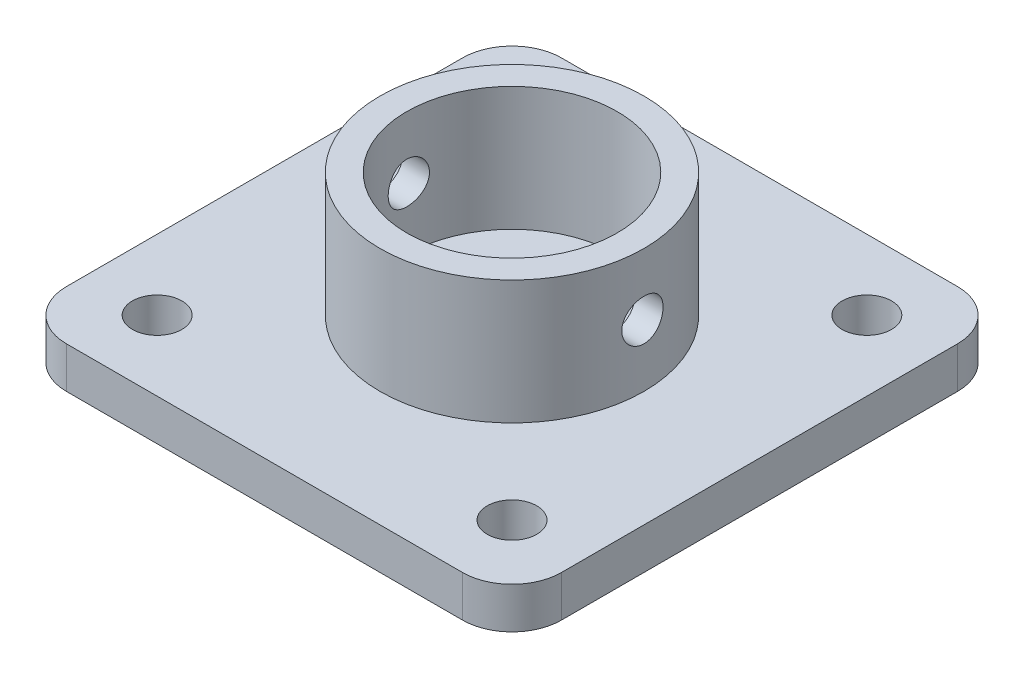
ISO-10303-21;
HEADER;
FILE_DESCRIPTION(('STEP AP214'),'2;1');
FILE_NAME('part.step','',(''),(''),'','','');
FILE_SCHEMA(('AUTOMOTIVE_DESIGN { 1 0 10303 214 1 1 1 1 }'));
ENDSEC;
DATA;
#1=APPLICATION_CONTEXT('core data for automotive mechanical design processes');
#2=APPLICATION_PROTOCOL_DEFINITION('international standard','automotive_design',2000,#1);
#3=PRODUCT_CONTEXT('',#1,'mechanical');
#4=PRODUCT('Part','Part','',(#3));
#5=PRODUCT_RELATED_PRODUCT_CATEGORY('part','',(#4));
#6=PRODUCT_DEFINITION_FORMATION('','',#4);
#7=PRODUCT_DEFINITION_CONTEXT('part definition',#1,'design');
#8=PRODUCT_DEFINITION('design','',#6,#7);
#9=PRODUCT_DEFINITION_SHAPE('','',#8);
#10=(LENGTH_UNIT() NAMED_UNIT(*) SI_UNIT(.MILLI.,.METRE.));
#11=(NAMED_UNIT(*) PLANE_ANGLE_UNIT() SI_UNIT($,.RADIAN.));
#12=(NAMED_UNIT(*) SI_UNIT($,.STERADIAN.) SOLID_ANGLE_UNIT());
#13=UNCERTAINTY_MEASURE_WITH_UNIT(LENGTH_MEASURE(1.E-05),#10,'distance_accuracy_value','');
#14=(GEOMETRIC_REPRESENTATION_CONTEXT(3) GLOBAL_UNCERTAINTY_ASSIGNED_CONTEXT((#13)) GLOBAL_UNIT_ASSIGNED_CONTEXT((#10,
#11,#12)) REPRESENTATION_CONTEXT('',''));
#15=CARTESIAN_POINT('',(0.,0.,0.));
#16=DIRECTION('',(0.,0.,1.));
#17=DIRECTION('',(1.,0.,0.));
#18=AXIS2_PLACEMENT_3D('',#15,#16,#17);
#19=CARTESIAN_POINT('',(0.,5.,0.));
#20=DIRECTION('',(0.,-1.,0.));
#21=DIRECTION('',(0.,0.,-1.));
#22=AXIS2_PLACEMENT_3D('',#19,#20,#21);
#23=PLANE('',#22);
#24=CARTESIAN_POINT('',(0.,5.,0.));
#25=DIRECTION('',(0.,-1.,0.));
#26=DIRECTION('',(0.,0.,-1.));
#27=AXIS2_PLACEMENT_3D('',#24,#25,#26);
#28=CIRCLE('',#27,16.);
#29=CARTESIAN_POINT('',(0.,5.,-16.));
#30=VERTEX_POINT('',#29);
#31=EDGE_CURVE('E11',#30,#30,#28,.F.);
#32=ORIENTED_EDGE('',*,*,#31,.F.);
#33=EDGE_LOOP('',(#32));
#34=FACE_BOUND('',#33,.T.);
#35=DIRECTION('',(0.,0.,1.));
#36=VECTOR('',#35,1.);
#37=CARTESIAN_POINT('',(-30.,5.,30.));
#38=LINE('',#37,#36);
#39=CARTESIAN_POINT('',(-30.,5.,-24.));
#40=VERTEX_POINT('',#39);
#41=CARTESIAN_POINT('',(-30.,5.,24.));
#42=VERTEX_POINT('',#41);
#43=EDGE_CURVE('E270',#40,#42,#38,.T.);
#44=ORIENTED_EDGE('',*,*,#43,.T.);
#45=CARTESIAN_POINT('',(-24.,5.,24.));
#46=DIRECTION('',(0.,-1.,0.));
#47=DIRECTION('',(0.,0.,-1.));
#48=AXIS2_PLACEMENT_3D('',#45,#46,#47);
#49=CIRCLE('',#48,6.);
#50=CARTESIAN_POINT('',(-24.,5.,30.));
#51=VERTEX_POINT('',#50);
#52=EDGE_CURVE('E168',#42,#51,#49,.F.);
#53=ORIENTED_EDGE('',*,*,#52,.T.);
#54=DIRECTION('',(1.,0.,0.));
#55=VECTOR('',#54,1.);
#56=CARTESIAN_POINT('',(-30.,5.,30.));
#57=LINE('',#56,#55);
#58=CARTESIAN_POINT('',(24.,5.,30.));
#59=VERTEX_POINT('',#58);
#60=EDGE_CURVE('E139',#51,#59,#57,.T.);
#61=ORIENTED_EDGE('',*,*,#60,.T.);
#62=CARTESIAN_POINT('',(24.,5.,24.));
#63=DIRECTION('',(0.,-1.,0.));
#64=DIRECTION('',(0.,0.,-1.));
#65=AXIS2_PLACEMENT_3D('',#62,#63,#64);
#66=CIRCLE('',#65,6.);
#67=CARTESIAN_POINT('',(30.,5.,24.));
#68=VERTEX_POINT('',#67);
#69=EDGE_CURVE('E163',#59,#68,#66,.F.);
#70=ORIENTED_EDGE('',*,*,#69,.T.);
#71=DIRECTION('',(0.,0.,-1.));
#72=VECTOR('',#71,1.);
#73=CARTESIAN_POINT('',(30.,5.,30.));
#74=LINE('',#73,#72);
#75=CARTESIAN_POINT('',(30.,5.,-24.));
#76=VERTEX_POINT('',#75);
#77=EDGE_CURVE('E146',#68,#76,#74,.T.);
#78=ORIENTED_EDGE('',*,*,#77,.T.);
#79=CARTESIAN_POINT('',(24.,5.,-24.));
#80=DIRECTION('',(0.,-1.,0.));
#81=DIRECTION('',(0.,0.,-1.));
#82=AXIS2_PLACEMENT_3D('',#79,#80,#81);
#83=CIRCLE('',#82,6.);
#84=CARTESIAN_POINT('',(24.,5.,-30.));
#85=VERTEX_POINT('',#84);
#86=EDGE_CURVE('E74',#76,#85,#83,.F.);
#87=ORIENTED_EDGE('',*,*,#86,.T.);
#88=DIRECTION('',(-1.,0.,0.));
#89=VECTOR('',#88,1.);
#90=CARTESIAN_POINT('',(-30.,5.,-30.));
#91=LINE('',#90,#89);
#92=CARTESIAN_POINT('',(-24.,5.,-30.));
#93=VERTEX_POINT('',#92);
#94=EDGE_CURVE('E149',#85,#93,#91,.T.);
#95=ORIENTED_EDGE('',*,*,#94,.T.);
#96=CARTESIAN_POINT('',(-24.,5.,-24.));
#97=DIRECTION('',(0.,-1.,0.));
#98=DIRECTION('',(0.,0.,-1.));
#99=AXIS2_PLACEMENT_3D('',#96,#97,#98);
#100=CIRCLE('',#99,6.);
#101=EDGE_CURVE('E166',#93,#40,#100,.F.);
#102=ORIENTED_EDGE('',*,*,#101,.T.);
#103=EDGE_LOOP('',(#44,#53,#61,#70,#78,#87,#95,#102));
#104=FACE_BOUND('',#103,.T.);
#105=CARTESIAN_POINT('',(21.5,5.,-21.5));
#106=DIRECTION('',(0.,1.,0.));
#107=DIRECTION('',(0.,0.,1.));
#108=AXIS2_PLACEMENT_3D('',#105,#106,#107);
#109=CIRCLE('',#108,3.);
#110=CARTESIAN_POINT('',(21.5,5.,-18.5));
#111=VERTEX_POINT('',#110);
#112=EDGE_CURVE('E266',#111,#111,#109,.T.);
#113=ORIENTED_EDGE('',*,*,#112,.F.);
#114=EDGE_LOOP('',(#113));
#115=FACE_BOUND('',#114,.T.);
#116=CARTESIAN_POINT('',(-21.5,5.,-21.5));
#117=DIRECTION('',(0.,1.,0.));
#118=DIRECTION('',(0.,0.,1.));
#119=AXIS2_PLACEMENT_3D('',#116,#117,#118);
#120=CIRCLE('',#119,2.99999999999999);
#121=CARTESIAN_POINT('',(-21.5,5.,-18.5));
#122=VERTEX_POINT('',#121);
#123=EDGE_CURVE('E277',#122,#122,#120,.T.);
#124=ORIENTED_EDGE('',*,*,#123,.F.);
#125=EDGE_LOOP('',(#124));
#126=FACE_BOUND('',#125,.T.);
#127=CARTESIAN_POINT('',(-21.5,5.,21.5));
#128=DIRECTION('',(0.,1.,0.));
#129=DIRECTION('',(0.,0.,1.));
#130=AXIS2_PLACEMENT_3D('',#127,#128,#129);
#131=CIRCLE('',#130,3.);
#132=CARTESIAN_POINT('',(-21.5,5.,24.5));
#133=VERTEX_POINT('',#132);
#134=EDGE_CURVE('E283',#133,#133,#131,.T.);
#135=ORIENTED_EDGE('',*,*,#134,.F.);
#136=EDGE_LOOP('',(#135));
#137=FACE_BOUND('',#136,.T.);
#138=CARTESIAN_POINT('',(21.5,5.,21.5));
#139=DIRECTION('',(0.,1.,0.));
#140=DIRECTION('',(0.,0.,1.));
#141=AXIS2_PLACEMENT_3D('',#138,#139,#140);
#142=CIRCLE('',#141,3.);
#143=CARTESIAN_POINT('',(21.5,5.,24.5));
#144=VERTEX_POINT('',#143);
#145=EDGE_CURVE('E289',#144,#144,#142,.T.);
#146=ORIENTED_EDGE('',*,*,#145,.F.);
#147=EDGE_LOOP('',(#146));
#148=FACE_BOUND('',#147,.T.);
#149=ADVANCED_FACE('F45',(#34,#104,#115,#126,#137,#148),#23,.F.);
#150=CARTESIAN_POINT('',(0.,0.,0.));
#151=DIRECTION('',(0.,-1.,0.));
#152=DIRECTION('',(0.,0.,-1.));
#153=AXIS2_PLACEMENT_3D('',#150,#151,#152);
#154=PLANE('',#153);
#155=CARTESIAN_POINT('',(-21.5,0.,21.5));
#156=DIRECTION('',(0.,1.,0.));
#157=DIRECTION('',(0.,0.,1.));
#158=AXIS2_PLACEMENT_3D('',#155,#156,#157);
#159=CIRCLE('',#158,3.);
#160=CARTESIAN_POINT('',(-21.5,0.,24.5));
#161=VERTEX_POINT('',#160);
#162=EDGE_CURVE('E286',#161,#161,#159,.T.);
#163=ORIENTED_EDGE('',*,*,#162,.T.);
#164=EDGE_LOOP('',(#163));
#165=FACE_BOUND('',#164,.T.);
#166=CARTESIAN_POINT('',(21.5,0.,-21.5));
#167=DIRECTION('',(0.,1.,0.));
#168=DIRECTION('',(0.,0.,1.));
#169=AXIS2_PLACEMENT_3D('',#166,#167,#168);
#170=CIRCLE('',#169,3.);
#171=CARTESIAN_POINT('',(21.5,0.,-18.5));
#172=VERTEX_POINT('',#171);
#173=EDGE_CURVE('E274',#172,#172,#170,.T.);
#174=ORIENTED_EDGE('',*,*,#173,.T.);
#175=EDGE_LOOP('',(#174));
#176=FACE_BOUND('',#175,.T.);
#177=DIRECTION('',(1.,0.,0.));
#178=VECTOR('',#177,1.);
#179=CARTESIAN_POINT('',(-30.,0.,30.));
#180=LINE('',#179,#178);
#181=CARTESIAN_POINT('',(-24.,0.,30.));
#182=VERTEX_POINT('',#181);
#183=CARTESIAN_POINT('',(24.,0.,30.));
#184=VERTEX_POINT('',#183);
#185=EDGE_CURVE('E136',#182,#184,#180,.T.);
#186=ORIENTED_EDGE('',*,*,#185,.F.);
#187=CARTESIAN_POINT('',(-24.,0.,24.));
#188=DIRECTION('',(0.,-1.,0.));
#189=DIRECTION('',(0.,0.,-1.));
#190=AXIS2_PLACEMENT_3D('',#187,#188,#189);
#191=CIRCLE('',#190,6.);
#192=CARTESIAN_POINT('',(-30.,0.,24.));
#193=VERTEX_POINT('',#192);
#194=EDGE_CURVE('E119',#182,#193,#191,.T.);
#195=ORIENTED_EDGE('',*,*,#194,.T.);
#196=DIRECTION('',(0.,0.,1.));
#197=VECTOR('',#196,1.);
#198=CARTESIAN_POINT('',(-30.,0.,30.));
#199=LINE('',#198,#197);
#200=CARTESIAN_POINT('',(-30.,0.,-24.));
#201=VERTEX_POINT('',#200);
#202=EDGE_CURVE('E147',#201,#193,#199,.T.);
#203=ORIENTED_EDGE('',*,*,#202,.F.);
#204=CARTESIAN_POINT('',(-24.,0.,-24.));
#205=DIRECTION('',(0.,-1.,0.));
#206=DIRECTION('',(0.,0.,-1.));
#207=AXIS2_PLACEMENT_3D('',#204,#205,#206);
#208=CIRCLE('',#207,6.);
#209=CARTESIAN_POINT('',(-24.,0.,-30.));
#210=VERTEX_POINT('',#209);
#211=EDGE_CURVE('E130',#201,#210,#208,.T.);
#212=ORIENTED_EDGE('',*,*,#211,.T.);
#213=DIRECTION('',(-1.,0.,0.));
#214=VECTOR('',#213,1.);
#215=CARTESIAN_POINT('',(-30.,0.,-30.));
#216=LINE('',#215,#214);
#217=CARTESIAN_POINT('',(24.,0.,-30.));
#218=VERTEX_POINT('',#217);
#219=EDGE_CURVE('E151',#218,#210,#216,.T.);
#220=ORIENTED_EDGE('',*,*,#219,.F.);
#221=CARTESIAN_POINT('',(24.,0.,-24.));
#222=DIRECTION('',(0.,-1.,0.));
#223=DIRECTION('',(0.,0.,-1.));
#224=AXIS2_PLACEMENT_3D('',#221,#222,#223);
#225=CIRCLE('',#224,6.);
#226=CARTESIAN_POINT('',(30.,0.,-24.));
#227=VERTEX_POINT('',#226);
#228=EDGE_CURVE('E157',#218,#227,#225,.T.);
#229=ORIENTED_EDGE('',*,*,#228,.T.);
#230=DIRECTION('',(0.,0.,-1.));
#231=VECTOR('',#230,1.);
#232=CARTESIAN_POINT('',(30.,0.,30.));
#233=LINE('',#232,#231);
#234=CARTESIAN_POINT('',(30.,0.,24.));
#235=VERTEX_POINT('',#234);
#236=EDGE_CURVE('E265',#235,#227,#233,.T.);
#237=ORIENTED_EDGE('',*,*,#236,.F.);
#238=CARTESIAN_POINT('',(24.,0.,24.));
#239=DIRECTION('',(0.,-1.,0.));
#240=DIRECTION('',(0.,0.,-1.));
#241=AXIS2_PLACEMENT_3D('',#238,#239,#240);
#242=CIRCLE('',#241,6.);
#243=EDGE_CURVE('E140',#235,#184,#242,.T.);
#244=ORIENTED_EDGE('',*,*,#243,.T.);
#245=EDGE_LOOP('',(#186,#195,#203,#212,#220,#229,#237,#244));
#246=FACE_BOUND('',#245,.T.);
#247=CARTESIAN_POINT('',(-21.5,0.,-21.5));
#248=DIRECTION('',(0.,1.,0.));
#249=DIRECTION('',(0.,0.,1.));
#250=AXIS2_PLACEMENT_3D('',#247,#248,#249);
#251=CIRCLE('',#250,2.99999999999999);
#252=CARTESIAN_POINT('',(-21.5,0.,-18.5));
#253=VERTEX_POINT('',#252);
#254=EDGE_CURVE('E280',#253,#253,#251,.T.);
#255=ORIENTED_EDGE('',*,*,#254,.T.);
#256=EDGE_LOOP('',(#255));
#257=FACE_BOUND('',#256,.T.);
#258=CARTESIAN_POINT('',(21.5,0.,21.5));
#259=DIRECTION('',(0.,1.,0.));
#260=DIRECTION('',(0.,0.,1.));
#261=AXIS2_PLACEMENT_3D('',#258,#259,#260);
#262=CIRCLE('',#261,3.);
#263=CARTESIAN_POINT('',(21.5,0.,24.5));
#264=VERTEX_POINT('',#263);
#265=EDGE_CURVE('E292',#264,#264,#262,.T.);
#266=ORIENTED_EDGE('',*,*,#265,.T.);
#267=EDGE_LOOP('',(#266));
#268=FACE_BOUND('',#267,.T.);
#269=ADVANCED_FACE('F143',(#165,#176,#246,#257,#268),#154,.T.);
#270=CARTESIAN_POINT('',(30.,5.,30.));
#271=DIRECTION('',(-1.,0.,0.));
#272=DIRECTION('',(0.,0.,1.));
#273=AXIS2_PLACEMENT_3D('',#270,#271,#272);
#274=PLANE('',#273);
#275=ORIENTED_EDGE('',*,*,#236,.T.);
#276=DIRECTION('',(0.,-1.,0.));
#277=VECTOR('',#276,1.);
#278=CARTESIAN_POINT('',(30.,5.,-24.));
#279=LINE('',#278,#277);
#280=EDGE_CURVE('E59',#227,#76,#279,.F.);
#281=ORIENTED_EDGE('',*,*,#280,.T.);
#282=ORIENTED_EDGE('',*,*,#77,.F.);
#283=DIRECTION('',(0.,-1.,0.));
#284=VECTOR('',#283,1.);
#285=CARTESIAN_POINT('',(30.,5.,24.));
#286=LINE('',#285,#284);
#287=EDGE_CURVE('E174',#68,#235,#286,.T.);
#288=ORIENTED_EDGE('',*,*,#287,.T.);
#289=EDGE_LOOP('',(#275,#281,#282,#288));
#290=FACE_BOUND('',#289,.T.);
#291=ADVANCED_FACE('F235',(#290),#274,.F.);
#292=CARTESIAN_POINT('',(-30.,5.,-30.));
#293=DIRECTION('',(0.,0.,1.));
#294=DIRECTION('',(1.,0.,0.));
#295=AXIS2_PLACEMENT_3D('',#292,#293,#294);
#296=PLANE('',#295);
#297=ORIENTED_EDGE('',*,*,#219,.T.);
#298=DIRECTION('',(0.,-1.,0.));
#299=VECTOR('',#298,1.);
#300=CARTESIAN_POINT('',(-24.,5.,-30.));
#301=LINE('',#300,#299);
#302=EDGE_CURVE('E67',#210,#93,#301,.F.);
#303=ORIENTED_EDGE('',*,*,#302,.T.);
#304=ORIENTED_EDGE('',*,*,#94,.F.);
#305=DIRECTION('',(0.,-1.,0.));
#306=VECTOR('',#305,1.);
#307=CARTESIAN_POINT('',(24.,5.,-30.));
#308=LINE('',#307,#306);
#309=EDGE_CURVE('E170',#85,#218,#308,.T.);
#310=ORIENTED_EDGE('',*,*,#309,.T.);
#311=EDGE_LOOP('',(#297,#303,#304,#310));
#312=FACE_BOUND('',#311,.T.);
#313=ADVANCED_FACE('F242',(#312),#296,.F.);
#314=CARTESIAN_POINT('',(-30.,5.,30.));
#315=DIRECTION('',(1.,0.,0.));
#316=DIRECTION('',(0.,0.,-1.));
#317=AXIS2_PLACEMENT_3D('',#314,#315,#316);
#318=PLANE('',#317);
#319=ORIENTED_EDGE('',*,*,#202,.T.);
#320=DIRECTION('',(0.,-1.,0.));
#321=VECTOR('',#320,1.);
#322=CARTESIAN_POINT('',(-30.,5.,24.));
#323=LINE('',#322,#321);
#324=EDGE_CURVE('E124',#193,#42,#323,.F.);
#325=ORIENTED_EDGE('',*,*,#324,.T.);
#326=ORIENTED_EDGE('',*,*,#43,.F.);
#327=DIRECTION('',(0.,-1.,0.));
#328=VECTOR('',#327,1.);
#329=CARTESIAN_POINT('',(-30.,5.,-24.));
#330=LINE('',#329,#328);
#331=EDGE_CURVE('E129',#40,#201,#330,.T.);
#332=ORIENTED_EDGE('',*,*,#331,.T.);
#333=EDGE_LOOP('',(#319,#325,#326,#332));
#334=FACE_BOUND('',#333,.T.);
#335=ADVANCED_FACE('F239',(#334),#318,.F.);
#336=CARTESIAN_POINT('',(-30.,5.,30.));
#337=DIRECTION('',(0.,0.,-1.));
#338=DIRECTION('',(-1.,0.,0.));
#339=AXIS2_PLACEMENT_3D('',#336,#337,#338);
#340=PLANE('',#339);
#341=ORIENTED_EDGE('',*,*,#60,.F.);
#342=DIRECTION('',(0.,-1.,0.));
#343=VECTOR('',#342,1.);
#344=CARTESIAN_POINT('',(-24.,5.,30.));
#345=LINE('',#344,#343);
#346=EDGE_CURVE('E123',#51,#182,#345,.T.);
#347=ORIENTED_EDGE('',*,*,#346,.T.);
#348=ORIENTED_EDGE('',*,*,#185,.T.);
#349=DIRECTION('',(0.,-1.,0.));
#350=VECTOR('',#349,1.);
#351=CARTESIAN_POINT('',(24.,5.,30.));
#352=LINE('',#351,#350);
#353=EDGE_CURVE('E141',#184,#59,#352,.F.);
#354=ORIENTED_EDGE('',*,*,#353,.T.);
#355=EDGE_LOOP('',(#341,#347,#348,#354));
#356=FACE_BOUND('',#355,.T.);
#357=ADVANCED_FACE('F135',(#356),#340,.F.);
#358=CARTESIAN_POINT('',(21.5,5.,-21.5));
#359=DIRECTION('',(0.,-1.,0.));
#360=DIRECTION('',(0.,0.,-1.));
#361=AXIS2_PLACEMENT_3D('',#358,#359,#360);
#362=CYLINDRICAL_SURFACE('',#361,3.);
#363=ORIENTED_EDGE('',*,*,#112,.T.);
#364=EDGE_LOOP('',(#363));
#365=FACE_BOUND('',#364,.T.);
#366=ORIENTED_EDGE('',*,*,#173,.F.);
#367=EDGE_LOOP('',(#366));
#368=FACE_BOUND('',#367,.T.);
#369=ADVANCED_FACE('F224',(#365,#368),#362,.F.);
#370=CARTESIAN_POINT('',(-21.5,5.,-21.5));
#371=DIRECTION('',(0.,-1.,0.));
#372=DIRECTION('',(0.,0.,-1.));
#373=AXIS2_PLACEMENT_3D('',#370,#371,#372);
#374=CYLINDRICAL_SURFACE('',#373,2.99999999999999);
#375=ORIENTED_EDGE('',*,*,#123,.T.);
#376=EDGE_LOOP('',(#375));
#377=FACE_BOUND('',#376,.T.);
#378=ORIENTED_EDGE('',*,*,#254,.F.);
#379=EDGE_LOOP('',(#378));
#380=FACE_BOUND('',#379,.T.);
#381=ADVANCED_FACE('F220',(#377,#380),#374,.F.);
#382=CARTESIAN_POINT('',(-21.5,5.,21.5));
#383=DIRECTION('',(0.,-1.,0.));
#384=DIRECTION('',(0.,0.,-1.));
#385=AXIS2_PLACEMENT_3D('',#382,#383,#384);
#386=CYLINDRICAL_SURFACE('',#385,3.);
#387=ORIENTED_EDGE('',*,*,#134,.T.);
#388=EDGE_LOOP('',(#387));
#389=FACE_BOUND('',#388,.T.);
#390=ORIENTED_EDGE('',*,*,#162,.F.);
#391=EDGE_LOOP('',(#390));
#392=FACE_BOUND('',#391,.T.);
#393=ADVANCED_FACE('F216',(#389,#392),#386,.F.);
#394=CARTESIAN_POINT('',(21.5,5.,21.5));
#395=DIRECTION('',(0.,-1.,0.));
#396=DIRECTION('',(0.,0.,-1.));
#397=AXIS2_PLACEMENT_3D('',#394,#395,#396);
#398=CYLINDRICAL_SURFACE('',#397,3.);
#399=ORIENTED_EDGE('',*,*,#145,.T.);
#400=EDGE_LOOP('',(#399));
#401=FACE_BOUND('',#400,.T.);
#402=ORIENTED_EDGE('',*,*,#265,.F.);
#403=EDGE_LOOP('',(#402));
#404=FACE_BOUND('',#403,.T.);
#405=ADVANCED_FACE('F212',(#401,#404),#398,.F.);
#406=CARTESIAN_POINT('',(-24.,5.,24.));
#407=DIRECTION('',(0.,-1.,0.));
#408=DIRECTION('',(0.,0.,-1.));
#409=AXIS2_PLACEMENT_3D('',#406,#407,#408);
#410=CYLINDRICAL_SURFACE('',#409,6.);
#411=ORIENTED_EDGE('',*,*,#52,.F.);
#412=ORIENTED_EDGE('',*,*,#324,.F.);
#413=ORIENTED_EDGE('',*,*,#194,.F.);
#414=ORIENTED_EDGE('',*,*,#346,.F.);
#415=EDGE_LOOP('',(#411,#412,#413,#414));
#416=FACE_BOUND('',#415,.T.);
#417=ADVANCED_FACE('F122',(#416),#410,.T.);
#418=CARTESIAN_POINT('',(-24.,5.,-24.));
#419=DIRECTION('',(0.,-1.,0.));
#420=DIRECTION('',(0.,0.,-1.));
#421=AXIS2_PLACEMENT_3D('',#418,#419,#420);
#422=CYLINDRICAL_SURFACE('',#421,6.);
#423=ORIENTED_EDGE('',*,*,#101,.F.);
#424=ORIENTED_EDGE('',*,*,#302,.F.);
#425=ORIENTED_EDGE('',*,*,#211,.F.);
#426=ORIENTED_EDGE('',*,*,#331,.F.);
#427=EDGE_LOOP('',(#423,#424,#425,#426));
#428=FACE_BOUND('',#427,.T.);
#429=ADVANCED_FACE('F251',(#428),#422,.T.);
#430=CARTESIAN_POINT('',(24.,5.,-24.));
#431=DIRECTION('',(0.,-1.,0.));
#432=DIRECTION('',(0.,0.,-1.));
#433=AXIS2_PLACEMENT_3D('',#430,#431,#432);
#434=CYLINDRICAL_SURFACE('',#433,6.);
#435=ORIENTED_EDGE('',*,*,#86,.F.);
#436=ORIENTED_EDGE('',*,*,#280,.F.);
#437=ORIENTED_EDGE('',*,*,#228,.F.);
#438=ORIENTED_EDGE('',*,*,#309,.F.);
#439=EDGE_LOOP('',(#435,#436,#437,#438));
#440=FACE_BOUND('',#439,.T.);
#441=ADVANCED_FACE('F253',(#440),#434,.T.);
#442=CARTESIAN_POINT('',(24.,5.,24.));
#443=DIRECTION('',(0.,-1.,0.));
#444=DIRECTION('',(0.,0.,-1.));
#445=AXIS2_PLACEMENT_3D('',#442,#443,#444);
#446=CYLINDRICAL_SURFACE('',#445,6.);
#447=ORIENTED_EDGE('',*,*,#69,.F.);
#448=ORIENTED_EDGE('',*,*,#353,.F.);
#449=ORIENTED_EDGE('',*,*,#243,.F.);
#450=ORIENTED_EDGE('',*,*,#287,.F.);
#451=EDGE_LOOP('',(#447,#448,#449,#450));
#452=FACE_BOUND('',#451,.T.);
#453=ADVANCED_FACE('F47',(#452),#446,.T.);
#454=CARTESIAN_POINT('',(0.,20.,0.));
#455=DIRECTION('',(0.,1.,0.));
#456=DIRECTION('',(0.,0.,1.));
#457=AXIS2_PLACEMENT_3D('',#454,#455,#456);
#458=PLANE('',#457);
#459=CARTESIAN_POINT('',(0.,20.,0.));
#460=DIRECTION('',(0.,1.,0.));
#461=DIRECTION('',(0.,0.,1.));
#462=AXIS2_PLACEMENT_3D('',#459,#460,#461);
#463=CIRCLE('',#462,16.);
#464=CARTESIAN_POINT('',(0.,20.,16.));
#465=VERTEX_POINT('',#464);
#466=EDGE_CURVE('E295',#465,#465,#463,.T.);
#467=ORIENTED_EDGE('',*,*,#466,.T.);
#468=EDGE_LOOP('',(#467));
#469=FACE_BOUND('',#468,.T.);
#470=CARTESIAN_POINT('',(0.,20.,0.));
#471=DIRECTION('',(0.,1.,0.));
#472=DIRECTION('',(0.,0.,1.));
#473=AXIS2_PLACEMENT_3D('',#470,#471,#472);
#474=CIRCLE('',#473,12.75);
#475=CARTESIAN_POINT('',(0.,20.,12.75));
#476=VERTEX_POINT('',#475);
#477=EDGE_CURVE('E300',#476,#476,#474,.T.);
#478=ORIENTED_EDGE('',*,*,#477,.F.);
#479=EDGE_LOOP('',(#478));
#480=FACE_BOUND('',#479,.T.);
#481=ADVANCED_FACE('F210',(#469,#480),#458,.T.);
#482=CARTESIAN_POINT('',(0.,20.,0.));
#483=DIRECTION('',(0.,-1.,0.));
#484=DIRECTION('',(0.,0.,-1.));
#485=AXIS2_PLACEMENT_3D('',#482,#483,#484);
#486=CYLINDRICAL_SURFACE('',#485,16.);
#487=CARTESIAN_POINT('',(-15.8034806292791,12.5,-2.5));
#488=CARTESIAN_POINT('',(-15.8034830346332,12.639503378341,-2.49999429179104));
#489=CARTESIAN_POINT('',(-15.8053478026579,12.7790859976853,-2.48828377742084));
#490=CARTESIAN_POINT('',(-15.8125997089632,13.0543436290029,-2.44176643645043));
#491=CARTESIAN_POINT('',(-15.8179902148259,13.1900147754794,-2.40693752801736));
#492=CARTESIAN_POINT('',(-15.8316684916183,13.4534255896444,-2.31525516047132));
#493=CARTESIAN_POINT('',(-15.8399539668268,13.5811714478708,-2.25841914921922));
#494=CARTESIAN_POINT('',(-15.8584858981599,13.8252968908421,-2.12437791816389));
#495=CARTESIAN_POINT('',(-15.8687321022282,13.9416779336595,-2.04717531605122));
#496=CARTESIAN_POINT('',(-15.8901303851737,14.1607964851513,-1.87387730110911));
#497=CARTESIAN_POINT('',(-15.9012888784461,14.2634210743996,-1.777639886175));
#498=CARTESIAN_POINT('',(-15.9231973082665,14.4511342204299,-1.56931080987672));
#499=CARTESIAN_POINT('',(-15.9339472216983,14.5362217862243,-1.45721825316849));
#500=CARTESIAN_POINT('',(-15.9538946715316,14.6868648770412,-1.21963429185761));
#501=CARTESIAN_POINT('',(-15.9630838016344,14.7523160039745,-1.09407592635729));
#502=CARTESIAN_POINT('',(-15.978803149105,14.8611579547251,-0.833580171794756));
#503=CARTESIAN_POINT('',(-15.9853335186778,14.9045500413827,-0.698643320136811));
#504=CARTESIAN_POINT('',(-15.9949542857973,14.9676987189562,-0.424385325448812));
#505=CARTESIAN_POINT('',(-15.9980722260505,14.9876446490684,-0.285108760160752));
#506=CARTESIAN_POINT('',(-16.0006113098095,15.0039230433034,-0.00515314355067147));
#507=CARTESIAN_POINT('',(-16.0000326754547,15.0002569263518,0.135525822989186));
#508=CARTESIAN_POINT('',(-15.9952657389868,14.9695640737221,0.413000089722151));
#509=CARTESIAN_POINT('',(-15.9911089169598,14.9427410611597,0.549818542575174));
#510=CARTESIAN_POINT('',(-15.9796877395528,14.8668159713774,0.816988375343491));
#511=CARTESIAN_POINT('',(-15.9724232987387,14.8177132816459,0.947339577352174));
#512=CARTESIAN_POINT('',(-15.9555491842028,14.69841634414,1.19848742679247));
#513=CARTESIAN_POINT('',(-15.9459300777042,14.6281369945721,1.31924299071837));
#514=CARTESIAN_POINT('',(-15.9254174702046,14.4685439193708,1.54732385653213));
#515=CARTESIAN_POINT('',(-15.9145238783282,14.379228836045,1.65464819959324));
#516=CARTESIAN_POINT('',(-15.8925387825556,14.1829665129267,1.85402198520023));
#517=CARTESIAN_POINT('',(-15.8814464071021,14.0758413336051,1.94589625613075));
#518=CARTESIAN_POINT('',(-15.8604269384475,13.8476024353179,2.11039226047485));
#519=CARTESIAN_POINT('',(-15.8504998536298,13.7264886157259,2.18301385538335));
#520=CARTESIAN_POINT('',(-15.8329349281613,13.4735203718942,2.30697060635685));
#521=CARTESIAN_POINT('',(-15.8252991458489,13.3416564249266,2.35828663884161));
#522=CARTESIAN_POINT('',(-15.8132168990948,13.0710351512945,2.43799343127668));
#523=CARTESIAN_POINT('',(-15.8087701897074,12.9322783549303,2.46638595195258));
#524=CARTESIAN_POINT('',(-15.8036163696886,12.6533718967248,2.49919719237856));
#525=CARTESIAN_POINT('',(-15.80287044806,12.5132521998052,2.50386473411271));
#526=CARTESIAN_POINT('',(-15.8050994977182,12.2342323647021,2.48975479033184));
#527=CARTESIAN_POINT('',(-15.8080743433524,12.0953321854941,2.47097809654328));
#528=CARTESIAN_POINT('',(-15.8173740105186,11.8234721925335,2.41072412555896));
#529=CARTESIAN_POINT('',(-15.8236803883335,11.6904840013604,2.36937178781979));
#530=CARTESIAN_POINT('',(-15.8389172439685,11.4333260288961,2.26527072241932));
#531=CARTESIAN_POINT('',(-15.8478478614411,11.309156717351,2.20252085602949));
#532=CARTESIAN_POINT('',(-15.8674179220711,11.0720487183512,2.05681199170293));
#533=CARTESIAN_POINT('',(-15.8780706945976,10.9592097711,1.97369251093471));
#534=CARTESIAN_POINT('',(-15.8998450469621,10.7489930191518,1.78982593995283));
#535=CARTESIAN_POINT('',(-15.9109666556111,10.651616166393,1.6890777652142));
#536=CARTESIAN_POINT('',(-15.9325473887455,10.4741887293645,1.47171546765808));
#537=CARTESIAN_POINT('',(-15.9429995842164,10.3943034235699,1.35496564158984));
#538=CARTESIAN_POINT('',(-15.9619548934084,10.2552804800098,1.10955861029337));
#539=CARTESIAN_POINT('',(-15.9704580640831,10.1961422359541,0.980901753162492));
#540=CARTESIAN_POINT('',(-15.9845269767683,10.1005537247159,0.715839663778327));
#541=CARTESIAN_POINT('',(-15.9901042225572,10.0640145025606,0.579467147617089));
#542=CARTESIAN_POINT('',(-15.9977412978946,10.0143738673272,0.302427949770746));
#543=CARTESIAN_POINT('',(-15.9998013804089,10.001270768644,0.161761577654431));
#544=CARTESIAN_POINT('',(-16.0001691012796,9.99891814734478,-0.118272165188271));
#545=CARTESIAN_POINT('',(-15.9985164403994,10.0094162553572,-0.257637428859786));
#546=CARTESIAN_POINT('',(-15.9917247801431,10.0534253161804,-0.532594595464882));
#547=CARTESIAN_POINT('',(-15.9865857947973,10.0869361763784,-0.668186513581641));
#548=CARTESIAN_POINT('',(-15.9733964142131,10.1759272597124,-0.931668850429401));
#549=CARTESIAN_POINT('',(-15.965348528289,10.2313885515809,-1.05956579651625));
#550=CARTESIAN_POINT('',(-15.947223323121,10.362678838522,-1.30427807253219));
#551=CARTESIAN_POINT('',(-15.9371459268214,10.4385086069742,-1.42109298145458));
#552=CARTESIAN_POINT('',(-15.9159528222148,10.6092894432084,-1.64160219185804));
#553=CARTESIAN_POINT('',(-15.9048276353277,10.704426314304,-1.745151694824));
#554=CARTESIAN_POINT('',(-15.8828612878644,10.9107299573354,-1.93490712736947));
#555=CARTESIAN_POINT('',(-15.8720201944801,11.0219004817247,-2.02110898563013));
#556=CARTESIAN_POINT('',(-15.8517779742959,11.2579211042754,-2.17420151541622));
#557=CARTESIAN_POINT('',(-15.842386091806,11.3828509586097,-2.24097044145097));
#558=CARTESIAN_POINT('',(-15.8262143333515,11.64224321763,-2.35247565604314));
#559=CARTESIAN_POINT('',(-15.8194317848938,11.7766957011166,-2.3972345005847));
#560=CARTESIAN_POINT('',(-15.8107909670081,12.0097697396964,-2.45344906957713));
#561=CARTESIAN_POINT('',(-15.8080643798014,12.1069615999849,-2.47087849275467));
#562=CARTESIAN_POINT('',(-15.804408373768,12.3027557810464,-2.49415589078729));
#563=CARTESIAN_POINT('',(-15.8034789284691,12.4013580810218,-2.50000403623692));
#564=CARTESIAN_POINT('',(-15.8034806292791,12.5,-2.5));
#565=B_SPLINE_CURVE_WITH_KNOTS('',3,(#487,#488,#489,#490,#491,#492,#493,#494,#495,#496,#497,
#498,#499,#500,#501,#502,#503,#504,#505,#506,#507,#508,#509,#510,#511,#512,#513,#514,#515,#516,
#517,#518,#519,#520,#521,#522,#523,#524,#525,#526,#527,#528,#529,#530,#531,#532,#533,#534,#535,
#536,#537,#538,#539,#540,#541,#542,#543,#544,#545,#546,#547,#548,#549,#550,#551,#552,#553,#554,
#555,#556,#557,#558,#559,#560,#561,#562,#563,#564),.UNSPECIFIED.,.T.,.F.,(4,2,2,2,2,2,2,2,2,2,2,
2,2,2,2,2,2,2,2,2,2,2,2,2,2,2,2,2,2,2,2,2,2,2,2,2,2,2,4),(0.,0.418149527902241,
0.836699032574077,1.25491737645053,1.67308199345223,2.09449258051085,2.51592697424482,
2.93956378022295,3.36317633102573,3.78334397517517,4.20348637030326,4.61996979150785,
5.03646466334576,5.45465612930833,5.87287743207563,6.29556043395287,6.71824647655855,
7.14131110038651,7.56434322607052,7.98292940034458,8.40150143908463,8.81778013452041,
9.23408098683358,9.65377352836981,10.0734918986585,10.4970197199928,10.9205351635679,
11.3423727623224,11.7641800198745,12.18149834073,12.5988149821383,13.0157724881518,
13.432745828047,13.8539404040181,14.275233715164,14.6991122166338,15.1225554163993,
15.4182305458031,15.7139013198205),.UNSPECIFIED.);
#566=CARTESIAN_POINT('',(-15.8034806292791,12.5,-2.5));
#567=VERTEX_POINT('',#566);
#568=EDGE_CURVE('E201',#567,#567,#565,.T.);
#569=ORIENTED_EDGE('',*,*,#568,.T.);
#570=EDGE_LOOP('',(#569));
#571=FACE_BOUND('',#570,.T.);
#572=CARTESIAN_POINT('',(15.8034806292791,12.5,-2.5));
#573=CARTESIAN_POINT('',(15.8034830346332,12.360496621659,-2.49999429179104));
#574=CARTESIAN_POINT('',(15.8053478026579,12.2209140023147,-2.48828377742084));
#575=CARTESIAN_POINT('',(15.8125997089632,11.9456563709972,-2.44176643645043));
#576=CARTESIAN_POINT('',(15.8179902148259,11.8099852245206,-2.40693752801736));
#577=CARTESIAN_POINT('',(15.8316684916183,11.5465744103556,-2.31525516047132));
#578=CARTESIAN_POINT('',(15.8399539668268,11.4188285521293,-2.25841914921922));
#579=CARTESIAN_POINT('',(15.8584858981599,11.1747031091579,-2.12437791816389));
#580=CARTESIAN_POINT('',(15.8687321022282,11.0583220663405,-2.04717531605122));
#581=CARTESIAN_POINT('',(15.8901303851737,10.8392035148487,-1.87387730110911));
#582=CARTESIAN_POINT('',(15.9012888784461,10.7365789256004,-1.777639886175));
#583=CARTESIAN_POINT('',(15.9231973082665,10.5488657795701,-1.56931080987672));
#584=CARTESIAN_POINT('',(15.9339472216983,10.4637782137757,-1.45721825316848));
#585=CARTESIAN_POINT('',(15.9538946715316,10.3131351229589,-1.21963429185761));
#586=CARTESIAN_POINT('',(15.9630838016344,10.2476839960255,-1.09407592635729));
#587=CARTESIAN_POINT('',(15.978803149105,10.1388420452749,-0.833580171794756));
#588=CARTESIAN_POINT('',(15.9853335186778,10.0954499586173,-0.698643320136811));
#589=CARTESIAN_POINT('',(15.9949542857973,10.0323012810438,-0.424385325448812));
#590=CARTESIAN_POINT('',(15.9980722260505,10.0123553509317,-0.285108760160752));
#591=CARTESIAN_POINT('',(16.0006113098095,9.99607695669663,-0.00515314355067136));
#592=CARTESIAN_POINT('',(16.0000326754547,9.99974307364816,0.135525822989186));
#593=CARTESIAN_POINT('',(15.9952657389868,10.0304359262779,0.413000089722151));
#594=CARTESIAN_POINT('',(15.9911089169598,10.0572589388403,0.549818542575174));
#595=CARTESIAN_POINT('',(15.9796877395528,10.1331840286226,0.816988375343491));
#596=CARTESIAN_POINT('',(15.9724232987387,10.1822867183541,0.947339577352174));
#597=CARTESIAN_POINT('',(15.9555491842028,10.3015836558601,1.19848742679247));
#598=CARTESIAN_POINT('',(15.9459300777042,10.371863005428,1.31924299071837));
#599=CARTESIAN_POINT('',(15.9254174702046,10.5314560806292,1.54732385653213));
#600=CARTESIAN_POINT('',(15.9145238783282,10.620771163955,1.65464819959324));
#601=CARTESIAN_POINT('',(15.8925387825556,10.8170334870733,1.85402198520023));
#602=CARTESIAN_POINT('',(15.8814464071021,10.9241586663949,1.94589625613075));
#603=CARTESIAN_POINT('',(15.8604269384475,11.1523975646821,2.11039226047485));
#604=CARTESIAN_POINT('',(15.8504998536298,11.2735113842741,2.18301385538335));
#605=CARTESIAN_POINT('',(15.8329349281613,11.5264796281058,2.30697060635685));
#606=CARTESIAN_POINT('',(15.8252991458489,11.6583435750735,2.35828663884161));
#607=CARTESIAN_POINT('',(15.8132168990948,11.9289648487055,2.43799343127668));
#608=CARTESIAN_POINT('',(15.8087701897074,12.0677216450697,2.46638595195258));
#609=CARTESIAN_POINT('',(15.8036163696886,12.3466281032752,2.49919719237856));
#610=CARTESIAN_POINT('',(15.80287044806,12.4867478001948,2.50386473411271));
#611=CARTESIAN_POINT('',(15.8050994977182,12.7657676352979,2.48975479033184));
#612=CARTESIAN_POINT('',(15.8080743433524,12.9046678145059,2.47097809654328));
#613=CARTESIAN_POINT('',(15.8173740105186,13.1765278074665,2.41072412555896));
#614=CARTESIAN_POINT('',(15.8236803883335,13.3095159986396,2.36937178781979));
#615=CARTESIAN_POINT('',(15.8389172439685,13.5666739711039,2.26527072241932));
#616=CARTESIAN_POINT('',(15.8478478614411,13.690843282649,2.20252085602949));
#617=CARTESIAN_POINT('',(15.8674179220711,13.9279512816488,2.05681199170293));
#618=CARTESIAN_POINT('',(15.8780706945976,14.0407902289,1.97369251093471));
#619=CARTESIAN_POINT('',(15.8998450469621,14.2510069808482,1.78982593995283));
#620=CARTESIAN_POINT('',(15.9109666556111,14.348383833607,1.6890777652142));
#621=CARTESIAN_POINT('',(15.9325473887455,14.5258112706355,1.47171546765808));
#622=CARTESIAN_POINT('',(15.9429995842164,14.6056965764301,1.35496564158984));
#623=CARTESIAN_POINT('',(15.9619548934084,14.7447195199902,1.10955861029337));
#624=CARTESIAN_POINT('',(15.9704580640831,14.8038577640459,0.980901753162492));
#625=CARTESIAN_POINT('',(15.9845269767683,14.8994462752842,0.715839663778327));
#626=CARTESIAN_POINT('',(15.9901042225572,14.9359854974394,0.579467147617089));
#627=CARTESIAN_POINT('',(15.9977412978946,14.9856261326728,0.302427949770746));
#628=CARTESIAN_POINT('',(15.9998013804089,14.998729231356,0.161761577654431));
#629=CARTESIAN_POINT('',(16.0001691012796,15.0010818526552,-0.118272165188271));
#630=CARTESIAN_POINT('',(15.9985164403994,14.9905837446428,-0.257637428859786));
#631=CARTESIAN_POINT('',(15.9917247801431,14.9465746838197,-0.532594595464882));
#632=CARTESIAN_POINT('',(15.9865857947973,14.9130638236216,-0.668186513581641));
#633=CARTESIAN_POINT('',(15.9733964142131,14.8240727402876,-0.931668850429401));
#634=CARTESIAN_POINT('',(15.965348528289,14.7686114484191,-1.05956579651625));
#635=CARTESIAN_POINT('',(15.947223323121,14.637321161478,-1.30427807253219));
#636=CARTESIAN_POINT('',(15.9371459268214,14.5614913930258,-1.42109298145458));
#637=CARTESIAN_POINT('',(15.9159528222148,14.3907105567916,-1.64160219185804));
#638=CARTESIAN_POINT('',(15.9048276353277,14.295573685696,-1.745151694824));
#639=CARTESIAN_POINT('',(15.8828612878644,14.0892700426646,-1.93490712736947));
#640=CARTESIAN_POINT('',(15.8720201944801,13.9780995182753,-2.02110898563013));
#641=CARTESIAN_POINT('',(15.8517779742959,13.7420788957246,-2.17420151541622));
#642=CARTESIAN_POINT('',(15.842386091806,13.6171490413903,-2.24097044145097));
#643=CARTESIAN_POINT('',(15.8262143333515,13.35775678237,-2.35247565604314));
#644=CARTESIAN_POINT('',(15.8194317848938,13.2233042988834,-2.3972345005847));
#645=CARTESIAN_POINT('',(15.8107909670081,12.9902302603036,-2.45344906957713));
#646=CARTESIAN_POINT('',(15.8080643798014,12.8930384000151,-2.47087849275467));
#647=CARTESIAN_POINT('',(15.804408373768,12.6972442189536,-2.49415589078729));
#648=CARTESIAN_POINT('',(15.8034789284691,12.5986419189782,-2.50000403623692));
#649=CARTESIAN_POINT('',(15.8034806292791,12.5,-2.5));
#650=B_SPLINE_CURVE_WITH_KNOTS('',3,(#572,#573,#574,#575,#576,#577,#578,#579,#580,#581,#582,
#583,#584,#585,#586,#587,#588,#589,#590,#591,#592,#593,#594,#595,#596,#597,#598,#599,#600,#601,
#602,#603,#604,#605,#606,#607,#608,#609,#610,#611,#612,#613,#614,#615,#616,#617,#618,#619,#620,
#621,#622,#623,#624,#625,#626,#627,#628,#629,#630,#631,#632,#633,#634,#635,#636,#637,#638,#639,
#640,#641,#642,#643,#644,#645,#646,#647,#648,#649),.UNSPECIFIED.,.T.,.F.,(4,2,2,2,2,2,2,2,2,2,2,
2,2,2,2,2,2,2,2,2,2,2,2,2,2,2,2,2,2,2,2,2,2,2,2,2,2,2,4),(0.,0.418149527902241,
0.836699032574077,1.25491737645053,1.67308199345223,2.09449258051085,2.51592697424482,
2.93956378022295,3.36317633102573,3.78334397517517,4.20348637030326,4.61996979150785,
5.03646466334576,5.45465612930833,5.87287743207563,6.29556043395287,6.71824647655855,
7.14131110038651,7.56434322607052,7.98292940034458,8.40150143908463,8.81778013452042,
9.23408098683358,9.65377352836981,10.0734918986585,10.4970197199928,10.9205351635679,
11.3423727623224,11.7641800198745,12.18149834073,12.5988149821383,13.0157724881518,
13.432745828047,13.8539404040181,14.275233715164,14.6991122166338,15.1225554163993,
15.4182305458031,15.7139013198205),.UNSPECIFIED.);
#651=CARTESIAN_POINT('',(15.8034806292791,12.5,-2.5));
#652=VERTEX_POINT('',#651);
#653=EDGE_CURVE('E195',#652,#652,#650,.T.);
#654=ORIENTED_EDGE('',*,*,#653,.T.);
#655=EDGE_LOOP('',(#654));
#656=FACE_BOUND('',#655,.T.);
#657=ORIENTED_EDGE('',*,*,#466,.F.);
#658=EDGE_LOOP('',(#657));
#659=FACE_BOUND('',#658,.T.);
#660=ORIENTED_EDGE('',*,*,#31,.T.);
#661=EDGE_LOOP('',(#660));
#662=FACE_BOUND('',#661,.T.);
#663=ADVANCED_FACE('F206',(#571,#656,#659,#662),#486,.T.);
#664=CARTESIAN_POINT('',(0.,20.,0.));
#665=DIRECTION('',(0.,-1.,0.));
#666=DIRECTION('',(0.,0.,-1.));
#667=AXIS2_PLACEMENT_3D('',#664,#665,#666);
#668=CYLINDRICAL_SURFACE('',#667,12.75);
#669=CARTESIAN_POINT('',(-12.50249975005,12.5,-2.5));
#670=CARTESIAN_POINT('',(-12.50250249325,12.6389701019863,-2.4999947983363));
#671=CARTESIAN_POINT('',(-12.5048419917447,12.7780063420279,-2.48837304411326));
#672=CARTESIAN_POINT('',(-12.5139341358379,13.0521496657267,-2.44222945901014));
#673=CARTESIAN_POINT('',(-12.520690380572,13.187253451024,-2.40768895166161));
#674=CARTESIAN_POINT('',(-12.5378220783942,13.449525902564,-2.31681667038023));
#675=CARTESIAN_POINT('',(-12.548194004049,13.5767021608145,-2.26050612932511));
#676=CARTESIAN_POINT('',(-12.5713842208789,13.8197974098994,-2.12774976646669));
#677=CARTESIAN_POINT('',(-12.5842023581639,13.9357171081874,-2.05130521117051));
#678=CARTESIAN_POINT('',(-12.6110354223721,14.1545917797394,-1.87934279997922));
#679=CARTESIAN_POINT('',(-12.6250630366411,14.2573714305482,-1.7836037375303));
#680=CARTESIAN_POINT('',(-12.6526227054638,14.4455188555065,-1.57624797492215));
#681=CARTESIAN_POINT('',(-12.6661547259452,14.5308854343289,-1.46463018565368));
#682=CARTESIAN_POINT('',(-12.6913350589002,14.6824610847318,-1.22752739225392));
#683=CARTESIAN_POINT('',(-12.7029666707915,14.748503964674,-1.10193421911256));
#684=CARTESIAN_POINT('',(-12.7228932591469,14.8584856347602,-0.841168153786118));
#685=CARTESIAN_POINT('',(-12.7311885357104,14.9024264130512,-0.705996124494765));
#686=CARTESIAN_POINT('',(-12.7434181739063,14.9664119470412,-0.431728031006014));
#687=CARTESIAN_POINT('',(-12.7474064911239,14.9867526005329,-0.29270344431105));
#688=CARTESIAN_POINT('',(-12.7507590618471,15.0038832873805,-0.0131616157159306));
#689=CARTESIAN_POINT('',(-12.7501237443403,15.000675505595,0.127355486498475));
#690=CARTESIAN_POINT('',(-12.7443425515708,14.9710256093566,0.403861602591729));
#691=CARTESIAN_POINT('',(-12.7392585470196,14.9449021849607,0.539886271149351));
#692=CARTESIAN_POINT('',(-12.7252208724196,14.8706675736541,0.80558312653826));
#693=CARTESIAN_POINT('',(-12.7162670518516,14.8225555314763,0.935255066057159));
#694=CARTESIAN_POINT('',(-12.6953933687246,14.7054114816801,1.18547958344233));
#695=CARTESIAN_POINT('',(-12.6834557681116,14.6362538064733,1.30597178912631));
#696=CARTESIAN_POINT('',(-12.6579318607878,14.4790744853788,1.53375936914949));
#697=CARTESIAN_POINT('',(-12.6443453714687,14.3910507493165,1.6410532791722));
#698=CARTESIAN_POINT('',(-12.6167570687137,14.1968871445234,1.84128888767207));
#699=CARTESIAN_POINT('',(-12.6027521108027,14.0904683959414,1.93395992918867));
#700=CARTESIAN_POINT('',(-12.576121828251,13.8634599760531,2.10018275211626));
#701=CARTESIAN_POINT('',(-12.5634965277243,13.7428700571351,2.17373419938012));
#702=CARTESIAN_POINT('',(-12.5410493647811,13.4905632723138,2.29971811720615));
#703=CARTESIAN_POINT('',(-12.5312331389962,13.3588247122629,2.35210821126724));
#704=CARTESIAN_POINT('',(-12.515599353357,13.088178348905,2.4339321293907));
#705=CARTESIAN_POINT('',(-12.5097812943429,12.9492714428748,2.46336881918278));
#706=CARTESIAN_POINT('',(-12.5029021890894,12.6706805369874,2.49804881295843));
#707=CARTESIAN_POINT('',(-12.5017644261374,12.5310469536686,2.50368232698979));
#708=CARTESIAN_POINT('',(-12.5041690115827,12.2528349524162,2.49164478639211));
#709=CARTESIAN_POINT('',(-12.5077111055347,12.1142564775281,2.47397499877081));
#710=CARTESIAN_POINT('',(-12.5190045796553,11.8433907958893,2.416168388136));
#711=CARTESIAN_POINT('',(-12.5267171143875,11.7110575963828,2.37623879869432));
#712=CARTESIAN_POINT('',(-12.5454485900021,11.4549595554281,2.27526707716696));
#713=CARTESIAN_POINT('',(-12.5564677941719,11.3311953972403,2.21422326384068));
#714=CARTESIAN_POINT('',(-12.5807441257063,11.0940374736221,2.07186787145775));
#715=CARTESIAN_POINT('',(-12.5940276208721,10.9807934694804,1.99031138011219));
#716=CARTESIAN_POINT('',(-12.6212628928747,10.7694564340488,1.80957339592958));
#717=CARTESIAN_POINT('',(-12.6352147355967,10.6713649005223,1.71039016283811));
#718=CARTESIAN_POINT('',(-12.6624628807749,10.4916447374211,1.49546526871025));
#719=CARTESIAN_POINT('',(-12.6757465216405,10.4102794960088,1.37950149952832));
#720=CARTESIAN_POINT('',(-12.6999436879305,10.2681867941907,1.13532382150223));
#721=CARTESIAN_POINT('',(-12.7108573103391,10.2074584892371,1.00711041423848));
#722=CARTESIAN_POINT('',(-12.7290305817417,10.108750750601,0.742776658338338));
#723=CARTESIAN_POINT('',(-12.736310372138,10.0706456939421,0.606704665970139));
#724=CARTESIAN_POINT('',(-12.7464819845389,10.0178671290949,0.329934918772533));
#725=CARTESIAN_POINT('',(-12.7493743135583,10.0031909134612,0.189237700354051));
#726=CARTESIAN_POINT('',(-12.7504337382115,9.99778810413212,-0.0902696134508798));
#727=CARTESIAN_POINT('',(-12.748679077198,10.0066649423451,-0.229071900411264));
#728=CARTESIAN_POINT('',(-12.7408055697969,10.0472429063964,-0.503166060413883));
#729=CARTESIAN_POINT('',(-12.7346867739716,10.0789437677984,-0.638457974108037));
#730=CARTESIAN_POINT('',(-12.7187740022378,10.1640965363283,-0.901455829807267));
#731=CARTESIAN_POINT('',(-12.7089877879501,10.2175025273617,-1.02917713749089));
#732=CARTESIAN_POINT('',(-12.6867957024309,10.3445002799522,-1.27390360758089));
#733=CARTESIAN_POINT('',(-12.6743896341125,10.4180935602876,-1.39090796282015));
#734=CARTESIAN_POINT('',(-12.6480800662067,10.5847233328884,-1.61284498906058));
#735=CARTESIAN_POINT('',(-12.634156276862,10.6780444418056,-1.71756158954839));
#736=CARTESIAN_POINT('',(-12.6065034546325,10.8808941419935,-1.90998528549926));
#737=CARTESIAN_POINT('',(-12.5927744685321,10.9904265567514,-1.99768835696178));
#738=CARTESIAN_POINT('',(-12.566910707524,11.2239390014868,-2.15444878995146));
#739=CARTESIAN_POINT('',(-12.5547937663967,11.3480559415498,-2.2233052659368));
#740=CARTESIAN_POINT('',(-12.533742765361,11.6062985821054,-2.33907729569877));
#741=CARTESIAN_POINT('',(-12.5248057822571,11.740414952641,-2.38601301273768));
#742=CARTESIAN_POINT('',(-12.5129361041612,11.9790542133427,-2.4473691369858));
#743=CARTESIAN_POINT('',(-12.5090463997076,12.0822041175877,-2.4670708770883));
#744=CARTESIAN_POINT('',(-12.5038272282442,12.2902234882323,-2.49338806237619));
#745=CARTESIAN_POINT('',(-12.5024976792365,12.3950928994503,-2.50000392668243));
#746=CARTESIAN_POINT('',(-12.50249975005,12.5,-2.5));
#747=B_SPLINE_CURVE_WITH_KNOTS('',3,(#669,#670,#671,#672,#673,#674,#675,#676,#677,#678,#679,
#680,#681,#682,#683,#684,#685,#686,#687,#688,#689,#690,#691,#692,#693,#694,#695,#696,#697,#698,
#699,#700,#701,#702,#703,#704,#705,#706,#707,#708,#709,#710,#711,#712,#713,#714,#715,#716,#717,
#718,#719,#720,#721,#722,#723,#724,#725,#726,#727,#728,#729,#730,#731,#732,#733,#734,#735,#736,
#737,#738,#739,#740,#741,#742,#743,#744,#745,#746),.UNSPECIFIED.,.T.,.F.,(4,2,2,2,2,2,2,2,2,2,2,
2,2,2,2,2,2,2,2,2,2,2,2,2,2,2,2,2,2,2,2,2,2,2,2,2,2,2,4),(0.,0.416526258406166,0.83339236117689,
1.24985290520122,1.66628725850544,2.08779945611607,2.50934057886466,2.93440719104525,
3.35943556043549,3.77907529527793,4.19867609581911,4.61253236614432,5.02640473515423,
5.44279859202884,5.85923860512806,6.28265757960359,6.70608395354194,7.13035410215266,
7.55457127220226,7.97180651723285,8.38901907798883,8.80241083329984,9.21583551291211,
9.63445234379993,10.0531105269076,10.4779270290187,10.9027261438081,11.3251438092179,
11.7475126563511,12.1628152963454,12.5781131247742,12.9925369471906,13.4069919570823,
13.8278934274709,14.2488943274509,14.6742218674596,15.0991574062777,15.4135988656279,
15.7280302537296),.UNSPECIFIED.);
#748=CARTESIAN_POINT('',(-12.50249975005,12.5,-2.5));
#749=VERTEX_POINT('',#748);
#750=EDGE_CURVE('E49',#749,#749,#747,.T.);
#751=ORIENTED_EDGE('',*,*,#750,.F.);
#752=EDGE_LOOP('',(#751));
#753=FACE_BOUND('',#752,.T.);
#754=CARTESIAN_POINT('',(12.50249975005,12.5,-2.5));
#755=CARTESIAN_POINT('',(12.50250249325,12.3610298980137,-2.4999947983363));
#756=CARTESIAN_POINT('',(12.5048419917447,12.2219936579721,-2.48837304411326));
#757=CARTESIAN_POINT('',(12.5139341358379,11.9478503342733,-2.44222945901014));
#758=CARTESIAN_POINT('',(12.520690380572,11.812746548976,-2.40768895166161));
#759=CARTESIAN_POINT('',(12.5378220783942,11.550474097436,-2.31681667038023));
#760=CARTESIAN_POINT('',(12.548194004049,11.4232978391856,-2.26050612932511));
#761=CARTESIAN_POINT('',(12.5713842208789,11.1802025901006,-2.12774976646669));
#762=CARTESIAN_POINT('',(12.5842023581639,11.0642828918126,-2.05130521117051));
#763=CARTESIAN_POINT('',(12.6110354223721,10.8454082202606,-1.87934279997922));
#764=CARTESIAN_POINT('',(12.6250630366411,10.7426285694518,-1.7836037375303));
#765=CARTESIAN_POINT('',(12.6526227054638,10.5544811444935,-1.57624797492215));
#766=CARTESIAN_POINT('',(12.6661547259452,10.4691145656711,-1.46463018565368));
#767=CARTESIAN_POINT('',(12.6913350589002,10.3175389152682,-1.22752739225392));
#768=CARTESIAN_POINT('',(12.7029666707915,10.251496035326,-1.10193421911256));
#769=CARTESIAN_POINT('',(12.7228932591469,10.1415143652398,-0.841168153786118));
#770=CARTESIAN_POINT('',(12.7311885357104,10.0975735869488,-0.705996124494765));
#771=CARTESIAN_POINT('',(12.7434181739063,10.0335880529589,-0.431728031006014));
#772=CARTESIAN_POINT('',(12.7474064911239,10.0132473994671,-0.29270344431105));
#773=CARTESIAN_POINT('',(12.7507590618471,9.99611671261946,-0.0131616157159306));
#774=CARTESIAN_POINT('',(12.7501237443403,9.99932449440503,0.127355486498475));
#775=CARTESIAN_POINT('',(12.7443425515708,10.0289743906434,0.403861602591729));
#776=CARTESIAN_POINT('',(12.7392585470196,10.0550978150393,0.53988627114935));
#777=CARTESIAN_POINT('',(12.7252208724196,10.1293324263459,0.805583126538259));
#778=CARTESIAN_POINT('',(12.7162670518516,10.1774444685238,0.935255066057159));
#779=CARTESIAN_POINT('',(12.6953933687246,10.2945885183199,1.18547958344233));
#780=CARTESIAN_POINT('',(12.6834557681116,10.3637461935267,1.30597178912631));
#781=CARTESIAN_POINT('',(12.6579318607878,10.5209255146212,1.53375936914949));
#782=CARTESIAN_POINT('',(12.6443453714687,10.6089492506835,1.6410532791722));
#783=CARTESIAN_POINT('',(12.6167570687137,10.8031128554766,1.84128888767207));
#784=CARTESIAN_POINT('',(12.6027521108027,10.9095316040586,1.93395992918866));
#785=CARTESIAN_POINT('',(12.576121828251,11.1365400239469,2.10018275211626));
#786=CARTESIAN_POINT('',(12.5634965277243,11.2571299428649,2.17373419938012));
#787=CARTESIAN_POINT('',(12.5410493647811,11.5094367276862,2.29971811720615));
#788=CARTESIAN_POINT('',(12.5312331389962,11.6411752877372,2.35210821126724));
#789=CARTESIAN_POINT('',(12.515599353357,11.911821651095,2.4339321293907));
#790=CARTESIAN_POINT('',(12.5097812943429,12.0507285571252,2.46336881918278));
#791=CARTESIAN_POINT('',(12.5029021890894,12.3293194630126,2.49804881295843));
#792=CARTESIAN_POINT('',(12.5017644261374,12.4689530463314,2.50368232698979));
#793=CARTESIAN_POINT('',(12.5041690115827,12.7471650475838,2.49164478639211));
#794=CARTESIAN_POINT('',(12.5077111055347,12.8857435224719,2.47397499877081));
#795=CARTESIAN_POINT('',(12.5190045796553,13.1566092041107,2.416168388136));
#796=CARTESIAN_POINT('',(12.5267171143875,13.2889424036172,2.37623879869432));
#797=CARTESIAN_POINT('',(12.5454485900021,13.5450404445719,2.27526707716696));
#798=CARTESIAN_POINT('',(12.5564677941719,13.6688046027597,2.21422326384068));
#799=CARTESIAN_POINT('',(12.5807441257063,13.9059625263779,2.07186787145775));
#800=CARTESIAN_POINT('',(12.5940276208721,14.0192065305196,1.99031138011219));
#801=CARTESIAN_POINT('',(12.6212628928747,14.2305435659512,1.80957339592958));
#802=CARTESIAN_POINT('',(12.6352147355967,14.3286350994777,1.71039016283811));
#803=CARTESIAN_POINT('',(12.6624628807749,14.5083552625789,1.49546526871025));
#804=CARTESIAN_POINT('',(12.6757465216405,14.5897205039912,1.37950149952832));
#805=CARTESIAN_POINT('',(12.6999436879305,14.7318132058093,1.13532382150223));
#806=CARTESIAN_POINT('',(12.7108573103391,14.7925415107629,1.00711041423848));
#807=CARTESIAN_POINT('',(12.7290305817417,14.891249249399,0.742776658338337));
#808=CARTESIAN_POINT('',(12.736310372138,14.9293543060579,0.606704665970138));
#809=CARTESIAN_POINT('',(12.7464819845389,14.9821328709051,0.329934918772532));
#810=CARTESIAN_POINT('',(12.7493743135583,14.9968090865388,0.189237700354051));
#811=CARTESIAN_POINT('',(12.7504337382115,15.0022118958679,-0.0902696134508797));
#812=CARTESIAN_POINT('',(12.748679077198,14.9933350576549,-0.229071900411264));
#813=CARTESIAN_POINT('',(12.7408055697969,14.9527570936037,-0.503166060413883));
#814=CARTESIAN_POINT('',(12.7346867739716,14.9210562322016,-0.638457974108037));
#815=CARTESIAN_POINT('',(12.7187740022378,14.8359034636717,-0.901455829807267));
#816=CARTESIAN_POINT('',(12.7089877879501,14.7824974726384,-1.02917713749089));
#817=CARTESIAN_POINT('',(12.6867957024309,14.6554997200478,-1.27390360758089));
#818=CARTESIAN_POINT('',(12.6743896341125,14.5819064397124,-1.39090796282015));
#819=CARTESIAN_POINT('',(12.6480800662067,14.4152766671116,-1.61284498906058));
#820=CARTESIAN_POINT('',(12.634156276862,14.3219555581944,-1.71756158954839));
#821=CARTESIAN_POINT('',(12.6065034546325,14.1191058580066,-1.90998528549926));
#822=CARTESIAN_POINT('',(12.5927744685321,14.0095734432486,-1.99768835696178));
#823=CARTESIAN_POINT('',(12.566910707524,13.7760609985132,-2.15444878995146));
#824=CARTESIAN_POINT('',(12.5547937663967,13.6519440584503,-2.2233052659368));
#825=CARTESIAN_POINT('',(12.533742765361,13.3937014178946,-2.33907729569877));
#826=CARTESIAN_POINT('',(12.5248057822571,13.2595850473591,-2.38601301273768));
#827=CARTESIAN_POINT('',(12.5129361041612,13.0209457866573,-2.4473691369858));
#828=CARTESIAN_POINT('',(12.5090463997076,12.9177958824123,-2.4670708770883));
#829=CARTESIAN_POINT('',(12.5038272282442,12.7097765117677,-2.49338806237619));
#830=CARTESIAN_POINT('',(12.5024976792365,12.6049071005497,-2.50000392668243));
#831=CARTESIAN_POINT('',(12.50249975005,12.5,-2.5));
#832=B_SPLINE_CURVE_WITH_KNOTS('',3,(#754,#755,#756,#757,#758,#759,#760,#761,#762,#763,#764,
#765,#766,#767,#768,#769,#770,#771,#772,#773,#774,#775,#776,#777,#778,#779,#780,#781,#782,#783,
#784,#785,#786,#787,#788,#789,#790,#791,#792,#793,#794,#795,#796,#797,#798,#799,#800,#801,#802,
#803,#804,#805,#806,#807,#808,#809,#810,#811,#812,#813,#814,#815,#816,#817,#818,#819,#820,#821,
#822,#823,#824,#825,#826,#827,#828,#829,#830,#831),.UNSPECIFIED.,.T.,.F.,(4,2,2,2,2,2,2,2,2,2,2,
2,2,2,2,2,2,2,2,2,2,2,2,2,2,2,2,2,2,2,2,2,2,2,2,2,2,2,4),(0.,0.416526258406166,0.83339236117689,
1.24985290520122,1.66628725850544,2.08779945611607,2.50934057886466,2.93440719104525,
3.35943556043549,3.77907529527793,4.19867609581911,4.61253236614432,5.02640473515423,
5.44279859202884,5.85923860512806,6.28265757960358,6.70608395354194,7.13035410215266,
7.55457127220226,7.97180651723285,8.38901907798883,8.80241083329984,9.21583551291211,
9.63445234379993,10.0531105269076,10.4779270290187,10.9027261438081,11.3251438092179,
11.7475126563511,12.1628152963454,12.5781131247742,12.9925369471906,13.4069919570823,
13.8278934274709,14.2488943274509,14.6742218674596,15.0991574062777,15.4135988656279,
15.7280302537296),.UNSPECIFIED.);
#833=CARTESIAN_POINT('',(12.50249975005,12.5,-2.5));
#834=VERTEX_POINT('',#833);
#835=EDGE_CURVE('E177',#834,#834,#832,.T.);
#836=ORIENTED_EDGE('',*,*,#835,.F.);
#837=EDGE_LOOP('',(#836));
#838=FACE_BOUND('',#837,.T.);
#839=ORIENTED_EDGE('',*,*,#477,.T.);
#840=EDGE_LOOP('',(#839));
#841=FACE_BOUND('',#840,.T.);
#842=CARTESIAN_POINT('',(0.,5.,0.));
#843=DIRECTION('',(0.,1.,0.));
#844=DIRECTION('',(0.,0.,1.));
#845=AXIS2_PLACEMENT_3D('',#842,#843,#844);
#846=CIRCLE('',#845,12.75);
#847=CARTESIAN_POINT('',(0.,5.,12.75));
#848=VERTEX_POINT('',#847);
#849=EDGE_CURVE('E301',#848,#848,#846,.T.);
#850=ORIENTED_EDGE('',*,*,#849,.F.);
#851=EDGE_LOOP('',(#850));
#852=FACE_BOUND('',#851,.T.);
#853=ADVANCED_FACE('F182',(#753,#838,#841,#852),#668,.F.);
#854=ORIENTED_EDGE('',*,*,#849,.T.);
#855=EDGE_LOOP('',(#854));
#856=FACE_BOUND('',#855,.T.);
#857=ADVANCED_FACE('F232',(#856),#23,.F.);
#858=CARTESIAN_POINT('',(-30.,12.5,0.));
#859=DIRECTION('',(1.,0.,0.));
#860=DIRECTION('',(0.,0.,-1.));
#861=AXIS2_PLACEMENT_3D('',#858,#859,#860);
#862=CYLINDRICAL_SURFACE('',#861,2.5);
#863=ORIENTED_EDGE('',*,*,#835,.T.);
#864=EDGE_LOOP('',(#863));
#865=FACE_BOUND('',#864,.T.);
#866=ORIENTED_EDGE('',*,*,#653,.F.);
#867=EDGE_LOOP('',(#866));
#868=FACE_BOUND('',#867,.T.);
#869=ADVANCED_FACE('F188',(#865,#868),#862,.F.);
#870=ORIENTED_EDGE('',*,*,#750,.T.);
#871=EDGE_LOOP('',(#870));
#872=FACE_BOUND('',#871,.T.);
#873=ORIENTED_EDGE('',*,*,#568,.F.);
#874=EDGE_LOOP('',(#873));
#875=FACE_BOUND('',#874,.T.);
#876=ADVANCED_FACE('F185',(#872,#875),#862,.F.);
#877=CLOSED_SHELL('',(#149,#269,#291,#313,#335,#357,#369,#381,#393,#405,#417,#429,#441,#453,
#481,#663,#853,#857,#869,#876));
#878=MANIFOLD_SOLID_BREP('B2',#877);
#879=ADVANCED_BREP_SHAPE_REPRESENTATION('',(#18,#878),#14);
#880=SHAPE_DEFINITION_REPRESENTATION(#9,#879);
ENDSEC;
END-ISO-10303-21;
